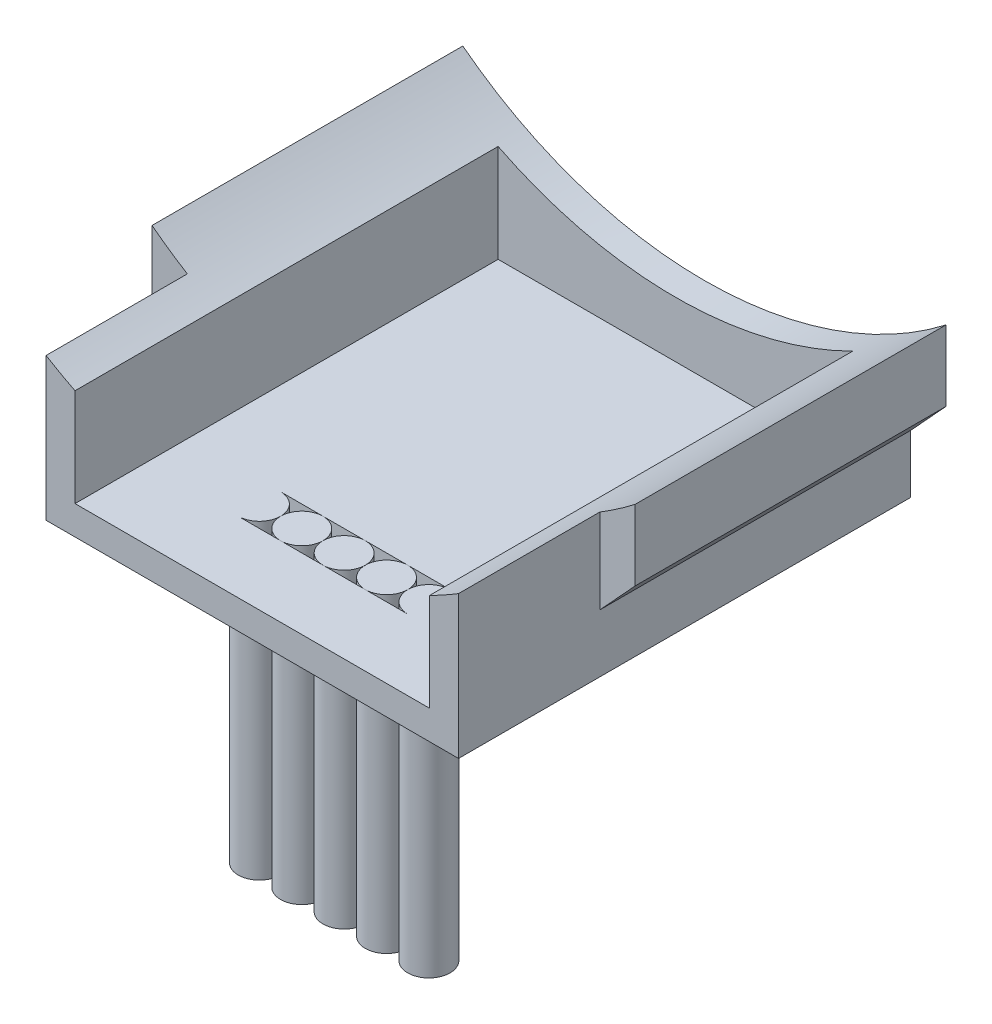
ISO-10303-21;
HEADER;
FILE_DESCRIPTION(('STEP AP214'),'2;1');
FILE_NAME('part.step','',(''),(''),'','','');
FILE_SCHEMA(('AUTOMOTIVE_DESIGN { 1 0 10303 214 1 1 1 1 }'));
ENDSEC;
DATA;
#1=APPLICATION_CONTEXT('core data for automotive mechanical design processes');
#2=APPLICATION_PROTOCOL_DEFINITION('international standard','automotive_design',2000,#1);
#3=PRODUCT_CONTEXT('',#1,'mechanical');
#4=PRODUCT('Part','Part','',(#3));
#5=PRODUCT_RELATED_PRODUCT_CATEGORY('part','',(#4));
#6=PRODUCT_DEFINITION_FORMATION('','',#4);
#7=PRODUCT_DEFINITION_CONTEXT('part definition',#1,'design');
#8=PRODUCT_DEFINITION('design','',#6,#7);
#9=PRODUCT_DEFINITION_SHAPE('','',#8);
#10=(LENGTH_UNIT() NAMED_UNIT(*) SI_UNIT(.MILLI.,.METRE.));
#11=(NAMED_UNIT(*) PLANE_ANGLE_UNIT() SI_UNIT($,.RADIAN.));
#12=(NAMED_UNIT(*) SI_UNIT($,.STERADIAN.) SOLID_ANGLE_UNIT());
#13=UNCERTAINTY_MEASURE_WITH_UNIT(LENGTH_MEASURE(1.E-05),#10,'distance_accuracy_value','');
#14=(GEOMETRIC_REPRESENTATION_CONTEXT(3) GLOBAL_UNCERTAINTY_ASSIGNED_CONTEXT((#13)) GLOBAL_UNIT_ASSIGNED_CONTEXT((#10,
#11,#12)) REPRESENTATION_CONTEXT('',''));
#15=CARTESIAN_POINT('',(0.,0.,0.));
#16=DIRECTION('',(0.,0.,1.));
#17=DIRECTION('',(1.,0.,0.));
#18=AXIS2_PLACEMENT_3D('',#15,#16,#17);
#19=CARTESIAN_POINT('',(-1.5,-26.975,-3.25));
#20=DIRECTION('',(0.,1.,0.));
#21=DIRECTION('',(0.,0.,1.));
#22=AXIS2_PLACEMENT_3D('',#19,#20,#21);
#23=CYLINDRICAL_SURFACE('',#22,0.749999999999999);
#24=CARTESIAN_POINT('',(-1.5,-26.975,-3.25));
#25=DIRECTION('',(0.,1.,0.));
#26=DIRECTION('',(0.,0.,1.));
#27=AXIS2_PLACEMENT_3D('',#24,#25,#26);
#28=CIRCLE('',#27,0.749999999999999);
#29=CARTESIAN_POINT('',(-1.5,-26.975,-2.5));
#30=VERTEX_POINT('',#29);
#31=EDGE_CURVE('E11',#30,#30,#28,.T.);
#32=ORIENTED_EDGE('',*,*,#31,.T.);
#33=EDGE_LOOP('',(#32));
#34=FACE_BOUND('',#33,.T.);
#35=CARTESIAN_POINT('',(-1.5,-15.975,-3.25));
#36=DIRECTION('',(0.,1.,0.));
#37=DIRECTION('',(0.,0.,1.));
#38=AXIS2_PLACEMENT_3D('',#35,#36,#37);
#39=CIRCLE('',#38,0.749999999999999);
#40=CARTESIAN_POINT('',(-1.5,-15.975,-2.5));
#41=VERTEX_POINT('',#40);
#42=EDGE_CURVE('E46',#41,#41,#39,.T.);
#43=ORIENTED_EDGE('',*,*,#42,.F.);
#44=EDGE_LOOP('',(#43));
#45=FACE_BOUND('',#44,.T.);
#46=ADVANCED_FACE('F43',(#34,#45),#23,.T.);
#47=CARTESIAN_POINT('',(0.,-26.975,0.));
#48=DIRECTION('',(0.,1.,0.));
#49=DIRECTION('',(0.,0.,1.));
#50=AXIS2_PLACEMENT_3D('',#47,#48,#49);
#51=PLANE('',#50);
#52=ORIENTED_EDGE('',*,*,#31,.F.);
#53=EDGE_LOOP('',(#52));
#54=FACE_BOUND('',#53,.T.);
#55=ADVANCED_FACE('F58',(#54),#51,.F.);
#56=CARTESIAN_POINT('',(0.,-15.975,0.));
#57=DIRECTION('',(0.,1.,0.));
#58=DIRECTION('',(0.,0.,1.));
#59=AXIS2_PLACEMENT_3D('',#56,#57,#58);
#60=PLANE('',#59);
#61=ORIENTED_EDGE('',*,*,#42,.T.);
#62=EDGE_LOOP('',(#61));
#63=FACE_BOUND('',#62,.T.);
#64=ADVANCED_FACE('F55',(#63),#60,.T.);
#65=CLOSED_SHELL('',(#46,#55,#64));
#66=MANIFOLD_SOLID_BREP('B2',#65);
#67=CARTESIAN_POINT('',(0.,-26.975,-3.25));
#68=DIRECTION('',(0.,1.,0.));
#69=DIRECTION('',(0.,0.,1.));
#70=AXIS2_PLACEMENT_3D('',#67,#68,#69);
#71=CYLINDRICAL_SURFACE('',#70,0.749999999999999);
#72=CARTESIAN_POINT('',(0.,-26.975,-3.25));
#73=DIRECTION('',(0.,1.,0.));
#74=DIRECTION('',(0.,0.,1.));
#75=AXIS2_PLACEMENT_3D('',#72,#73,#74);
#76=CIRCLE('',#75,0.749999999999999);
#77=CARTESIAN_POINT('',(0.,-26.975,-2.5));
#78=VERTEX_POINT('',#77);
#79=EDGE_CURVE('E42',#78,#78,#76,.T.);
#80=ORIENTED_EDGE('',*,*,#79,.T.);
#81=EDGE_LOOP('',(#80));
#82=FACE_BOUND('',#81,.T.);
#83=CARTESIAN_POINT('',(0.,-15.975,-3.25));
#84=DIRECTION('',(0.,1.,0.));
#85=DIRECTION('',(0.,0.,1.));
#86=AXIS2_PLACEMENT_3D('',#83,#84,#85);
#87=CIRCLE('',#86,0.749999999999999);
#88=CARTESIAN_POINT('',(0.,-15.975,-2.5));
#89=VERTEX_POINT('',#88);
#90=EDGE_CURVE('E102',#89,#89,#87,.T.);
#91=ORIENTED_EDGE('',*,*,#90,.F.);
#92=EDGE_LOOP('',(#91));
#93=FACE_BOUND('',#92,.T.);
#94=ADVANCED_FACE('F99',(#82,#93),#71,.T.);
#95=CARTESIAN_POINT('',(0.,-26.975,0.));
#96=DIRECTION('',(0.,1.,0.));
#97=DIRECTION('',(0.,0.,1.));
#98=AXIS2_PLACEMENT_3D('',#95,#96,#97);
#99=PLANE('',#98);
#100=ORIENTED_EDGE('',*,*,#79,.F.);
#101=EDGE_LOOP('',(#100));
#102=FACE_BOUND('',#101,.T.);
#103=ADVANCED_FACE('F114',(#102),#99,.F.);
#104=CARTESIAN_POINT('',(0.,-15.975,0.));
#105=DIRECTION('',(0.,1.,0.));
#106=DIRECTION('',(0.,0.,1.));
#107=AXIS2_PLACEMENT_3D('',#104,#105,#106);
#108=PLANE('',#107);
#109=ORIENTED_EDGE('',*,*,#90,.T.);
#110=EDGE_LOOP('',(#109));
#111=FACE_BOUND('',#110,.T.);
#112=ADVANCED_FACE('F111',(#111),#108,.T.);
#113=CLOSED_SHELL('',(#94,#103,#112));
#114=MANIFOLD_SOLID_BREP('B6',#113);
#115=CARTESIAN_POINT('',(1.5,-26.975,-3.25));
#116=DIRECTION('',(0.,1.,0.));
#117=DIRECTION('',(0.,0.,1.));
#118=AXIS2_PLACEMENT_3D('',#115,#116,#117);
#119=CYLINDRICAL_SURFACE('',#118,0.749999999999998);
#120=CARTESIAN_POINT('',(1.5,-26.975,-3.25));
#121=DIRECTION('',(0.,1.,0.));
#122=DIRECTION('',(0.,0.,1.));
#123=AXIS2_PLACEMENT_3D('',#120,#121,#122);
#124=CIRCLE('',#123,0.749999999999998);
#125=CARTESIAN_POINT('',(1.5,-26.975,-2.5));
#126=VERTEX_POINT('',#125);
#127=EDGE_CURVE('E98',#126,#126,#124,.T.);
#128=ORIENTED_EDGE('',*,*,#127,.T.);
#129=EDGE_LOOP('',(#128));
#130=FACE_BOUND('',#129,.T.);
#131=CARTESIAN_POINT('',(1.5,-15.975,-3.25));
#132=DIRECTION('',(0.,1.,0.));
#133=DIRECTION('',(0.,0.,1.));
#134=AXIS2_PLACEMENT_3D('',#131,#132,#133);
#135=CIRCLE('',#134,0.749999999999998);
#136=CARTESIAN_POINT('',(1.5,-15.975,-2.5));
#137=VERTEX_POINT('',#136);
#138=EDGE_CURVE('E159',#137,#137,#135,.T.);
#139=ORIENTED_EDGE('',*,*,#138,.F.);
#140=EDGE_LOOP('',(#139));
#141=FACE_BOUND('',#140,.T.);
#142=ADVANCED_FACE('F156',(#130,#141),#119,.T.);
#143=CARTESIAN_POINT('',(0.,-26.975,0.));
#144=DIRECTION('',(0.,1.,0.));
#145=DIRECTION('',(0.,0.,1.));
#146=AXIS2_PLACEMENT_3D('',#143,#144,#145);
#147=PLANE('',#146);
#148=ORIENTED_EDGE('',*,*,#127,.F.);
#149=EDGE_LOOP('',(#148));
#150=FACE_BOUND('',#149,.T.);
#151=ADVANCED_FACE('F171',(#150),#147,.F.);
#152=CARTESIAN_POINT('',(0.,-15.975,0.));
#153=DIRECTION('',(0.,1.,0.));
#154=DIRECTION('',(0.,0.,1.));
#155=AXIS2_PLACEMENT_3D('',#152,#153,#154);
#156=PLANE('',#155);
#157=ORIENTED_EDGE('',*,*,#138,.T.);
#158=EDGE_LOOP('',(#157));
#159=FACE_BOUND('',#158,.T.);
#160=ADVANCED_FACE('F168',(#159),#156,.T.);
#161=CLOSED_SHELL('',(#142,#151,#160));
#162=MANIFOLD_SOLID_BREP('B37',#161);
#163=CARTESIAN_POINT('',(-7.3,-17.,-16.));
#164=DIRECTION('',(-1.,0.,0.));
#165=DIRECTION('',(0.,0.,1.));
#166=AXIS2_PLACEMENT_3D('',#163,#164,#165);
#167=PLANE('',#166);
#168=DIRECTION('',(0.,0.,1.));
#169=VECTOR('',#168,1.);
#170=CARTESIAN_POINT('',(-7.3,-11.9461290801665,-16.));
#171=LINE('',#170,#169);
#172=CARTESIAN_POINT('',(-7.3,-11.9461290801665,-5.));
#173=VERTEX_POINT('',#172);
#174=CARTESIAN_POINT('',(-7.3,-11.9461290801665,0.));
#175=VERTEX_POINT('',#174);
#176=EDGE_CURVE('E455',#173,#175,#171,.T.);
#177=ORIENTED_EDGE('',*,*,#176,.F.);
#178=DIRECTION('',(0.,-1.,0.));
#179=VECTOR('',#178,1.);
#180=CARTESIAN_POINT('',(-7.3,-11.9461290801665,-5.));
#181=LINE('',#180,#179);
#182=CARTESIAN_POINT('',(-7.3,-14.9461290801665,-5.));
#183=VERTEX_POINT('',#182);
#184=EDGE_CURVE('E364',#173,#183,#181,.T.);
#185=ORIENTED_EDGE('',*,*,#184,.T.);
#186=DIRECTION('',(0.,0.,-1.));
#187=VECTOR('',#186,1.);
#188=CARTESIAN_POINT('',(-7.3,-14.9461290801665,-5.));
#189=LINE('',#188,#187);
#190=CARTESIAN_POINT('',(-7.3,-14.9461290801665,-16.));
#191=VERTEX_POINT('',#190);
#192=EDGE_CURVE('E373',#183,#191,#189,.T.);
#193=ORIENTED_EDGE('',*,*,#192,.T.);
#194=DIRECTION('',(0.,-1.,0.));
#195=VECTOR('',#194,1.);
#196=CARTESIAN_POINT('',(-7.3,-17.,-16.));
#197=LINE('',#196,#195);
#198=CARTESIAN_POINT('',(-7.3,-17.,-16.));
#199=VERTEX_POINT('',#198);
#200=EDGE_CURVE('E416',#191,#199,#197,.T.);
#201=ORIENTED_EDGE('',*,*,#200,.T.);
#202=DIRECTION('',(0.,0.,1.));
#203=VECTOR('',#202,1.);
#204=CARTESIAN_POINT('',(-7.3,-17.,-16.));
#205=LINE('',#204,#203);
#206=CARTESIAN_POINT('',(-7.3,-17.,0.));
#207=VERTEX_POINT('',#206);
#208=EDGE_CURVE('E453',#199,#207,#205,.T.);
#209=ORIENTED_EDGE('',*,*,#208,.T.);
#210=DIRECTION('',(0.,-1.,0.));
#211=VECTOR('',#210,1.);
#212=CARTESIAN_POINT('',(-7.3,-17.,0.));
#213=LINE('',#212,#211);
#214=EDGE_CURVE('E440',#175,#207,#213,.T.);
#215=ORIENTED_EDGE('',*,*,#214,.F.);
#216=EDGE_LOOP('',(#177,#185,#193,#201,#209,#215));
#217=FACE_BOUND('',#216,.T.);
#218=ADVANCED_FACE('F204',(#217),#167,.T.);
#219=CARTESIAN_POINT('',(7.3,-17.,-16.));
#220=DIRECTION('',(1.,0.,0.));
#221=DIRECTION('',(0.,0.,-1.));
#222=AXIS2_PLACEMENT_3D('',#219,#220,#221);
#223=PLANE('',#222);
#224=DIRECTION('',(0.,0.,-1.));
#225=VECTOR('',#224,1.);
#226=CARTESIAN_POINT('',(7.3,-14.9461290801665,-5.));
#227=LINE('',#226,#225);
#228=CARTESIAN_POINT('',(7.3,-14.9461290801665,-5.));
#229=VERTEX_POINT('',#228);
#230=CARTESIAN_POINT('',(7.3,-14.9461290801665,-16.));
#231=VERTEX_POINT('',#230);
#232=EDGE_CURVE('E398',#229,#231,#227,.T.);
#233=ORIENTED_EDGE('',*,*,#232,.F.);
#234=DIRECTION('',(0.,1.,0.));
#235=VECTOR('',#234,1.);
#236=CARTESIAN_POINT('',(7.3,-11.9461290801665,-5.));
#237=LINE('',#236,#235);
#238=CARTESIAN_POINT('',(7.3,-11.9461290801665,-5.));
#239=VERTEX_POINT('',#238);
#240=EDGE_CURVE('E390',#229,#239,#237,.T.);
#241=ORIENTED_EDGE('',*,*,#240,.T.);
#242=DIRECTION('',(0.,0.,1.));
#243=VECTOR('',#242,1.);
#244=CARTESIAN_POINT('',(7.3,-11.9461290801665,-16.));
#245=LINE('',#244,#243);
#246=CARTESIAN_POINT('',(7.3,-11.9461290801665,0.));
#247=VERTEX_POINT('',#246);
#248=EDGE_CURVE('E448',#239,#247,#245,.T.);
#249=ORIENTED_EDGE('',*,*,#248,.T.);
#250=DIRECTION('',(0.,1.,0.));
#251=VECTOR('',#250,1.);
#252=CARTESIAN_POINT('',(7.3,-17.,0.));
#253=LINE('',#252,#251);
#254=CARTESIAN_POINT('',(7.3,-17.,0.));
#255=VERTEX_POINT('',#254);
#256=EDGE_CURVE('E417',#255,#247,#253,.T.);
#257=ORIENTED_EDGE('',*,*,#256,.F.);
#258=DIRECTION('',(0.,0.,1.));
#259=VECTOR('',#258,1.);
#260=CARTESIAN_POINT('',(7.3,-17.,-16.));
#261=LINE('',#260,#259);
#262=CARTESIAN_POINT('',(7.3,-17.,-16.));
#263=VERTEX_POINT('',#262);
#264=EDGE_CURVE('E451',#263,#255,#261,.T.);
#265=ORIENTED_EDGE('',*,*,#264,.F.);
#266=DIRECTION('',(0.,1.,0.));
#267=VECTOR('',#266,1.);
#268=CARTESIAN_POINT('',(7.3,-17.,-16.));
#269=LINE('',#268,#267);
#270=EDGE_CURVE('E422',#263,#231,#269,.T.);
#271=ORIENTED_EDGE('',*,*,#270,.T.);
#272=EDGE_LOOP('',(#233,#241,#249,#257,#265,#271));
#273=FACE_BOUND('',#272,.T.);
#274=ADVANCED_FACE('F499',(#273),#223,.T.);
#275=CARTESIAN_POINT('',(-7.3,-17.,-16.));
#276=DIRECTION('',(0.,-1.,0.));
#277=DIRECTION('',(1.,0.,0.));
#278=AXIS2_PLACEMENT_3D('',#275,#276,#277);
#279=PLANE('',#278);
#280=CARTESIAN_POINT('',(-3.,-17.,-3.25));
#281=DIRECTION('',(0.,-1.,0.));
#282=DIRECTION('',(1.,0.,0.));
#283=AXIS2_PLACEMENT_3D('',#280,#281,#282);
#284=CIRCLE('',#283,0.75);
#285=CARTESIAN_POINT('',(-3.,-17.,-2.5));
#286=VERTEX_POINT('',#285);
#287=CARTESIAN_POINT('',(-3.,-17.,-4.));
#288=VERTEX_POINT('',#287);
#289=EDGE_CURVE('E219',#286,#288,#284,.T.);
#290=ORIENTED_EDGE('',*,*,#289,.F.);
#291=DIRECTION('',(-1.,0.,0.));
#292=VECTOR('',#291,1.);
#293=CARTESIAN_POINT('',(-3.,-17.,-2.5));
#294=LINE('',#293,#292);
#295=CARTESIAN_POINT('',(3.,-17.,-2.5));
#296=VERTEX_POINT('',#295);
#297=EDGE_CURVE('E344',#296,#286,#294,.T.);
#298=ORIENTED_EDGE('',*,*,#297,.F.);
#299=CARTESIAN_POINT('',(3.,-17.,-3.25));
#300=DIRECTION('',(0.,-1.,0.));
#301=DIRECTION('',(-1.,0.,0.));
#302=AXIS2_PLACEMENT_3D('',#299,#300,#301);
#303=CIRCLE('',#302,0.75);
#304=CARTESIAN_POINT('',(3.,-17.,-4.));
#305=VERTEX_POINT('',#304);
#306=EDGE_CURVE('E338',#305,#296,#303,.T.);
#307=ORIENTED_EDGE('',*,*,#306,.F.);
#308=DIRECTION('',(1.,0.,0.));
#309=VECTOR('',#308,1.);
#310=CARTESIAN_POINT('',(-3.,-17.,-4.));
#311=LINE('',#310,#309);
#312=EDGE_CURVE('E331',#288,#305,#311,.T.);
#313=ORIENTED_EDGE('',*,*,#312,.F.);
#314=EDGE_LOOP('',(#290,#298,#307,#313));
#315=FACE_BOUND('',#314,.T.);
#316=DIRECTION('',(1.,0.,0.));
#317=VECTOR('',#316,1.);
#318=CARTESIAN_POINT('',(-7.3,-17.,0.));
#319=LINE('',#318,#317);
#320=EDGE_CURVE('E443',#207,#255,#319,.T.);
#321=ORIENTED_EDGE('',*,*,#320,.F.);
#322=ORIENTED_EDGE('',*,*,#208,.F.);
#323=DIRECTION('',(1.,0.,0.));
#324=VECTOR('',#323,1.);
#325=CARTESIAN_POINT('',(-7.3,-17.,-16.));
#326=LINE('',#325,#324);
#327=EDGE_CURVE('E419',#199,#263,#326,.T.);
#328=ORIENTED_EDGE('',*,*,#327,.T.);
#329=ORIENTED_EDGE('',*,*,#264,.T.);
#330=EDGE_LOOP('',(#321,#322,#328,#329));
#331=FACE_BOUND('',#330,.T.);
#332=ADVANCED_FACE('F342',(#315,#331),#279,.T.);
#333=CARTESIAN_POINT('',(0.,0.,-16.));
#334=DIRECTION('',(0.,0.,1.));
#335=DIRECTION('',(1.,0.,0.));
#336=AXIS2_PLACEMENT_3D('',#333,#334,#335);
#337=CYLINDRICAL_SURFACE('',#336,14.);
#338=DIRECTION('',(0.,0.,1.));
#339=VECTOR('',#338,1.);
#340=CARTESIAN_POINT('',(-6.275,-12.514966040705,-16.));
#341=LINE('',#340,#339);
#342=CARTESIAN_POINT('',(-6.275,-12.514966040705,-14.975));
#343=VERTEX_POINT('',#342);
#344=CARTESIAN_POINT('',(-6.275,-12.514966040705,0.));
#345=VERTEX_POINT('',#344);
#346=EDGE_CURVE('E457',#343,#345,#341,.T.);
#347=ORIENTED_EDGE('',*,*,#346,.F.);
#348=CARTESIAN_POINT('',(0.,0.,-14.975));
#349=DIRECTION('',(0.,0.,1.));
#350=DIRECTION('',(1.,0.,0.));
#351=AXIS2_PLACEMENT_3D('',#348,#349,#350);
#352=CIRCLE('',#351,14.);
#353=CARTESIAN_POINT('',(6.275,-12.514966040705,-14.975));
#354=VERTEX_POINT('',#353);
#355=EDGE_CURVE('E400',#354,#343,#352,.F.);
#356=ORIENTED_EDGE('',*,*,#355,.F.);
#357=DIRECTION('',(0.,0.,1.));
#358=VECTOR('',#357,1.);
#359=CARTESIAN_POINT('',(6.275,-12.514966040705,-16.));
#360=LINE('',#359,#358);
#361=CARTESIAN_POINT('',(6.275,-12.514966040705,0.));
#362=VERTEX_POINT('',#361);
#363=EDGE_CURVE('E425',#354,#362,#360,.T.);
#364=ORIENTED_EDGE('',*,*,#363,.T.);
#365=CARTESIAN_POINT('',(0.,0.,0.));
#366=DIRECTION('',(0.,0.,-1.));
#367=DIRECTION('',(1.,0.,0.));
#368=AXIS2_PLACEMENT_3D('',#365,#366,#367);
#369=CIRCLE('',#368,14.);
#370=EDGE_CURVE('E413',#247,#362,#369,.T.);
#371=ORIENTED_EDGE('',*,*,#370,.F.);
#372=ORIENTED_EDGE('',*,*,#248,.F.);
#373=CARTESIAN_POINT('',(0.,0.,-5.));
#374=DIRECTION('',(0.,0.,1.));
#375=DIRECTION('',(-1.,0.,0.));
#376=AXIS2_PLACEMENT_3D('',#373,#374,#375);
#377=CIRCLE('',#376,14.);
#378=CARTESIAN_POINT('',(8.55,-11.0859144864102,-5.));
#379=VERTEX_POINT('',#378);
#380=EDGE_CURVE('E381',#239,#379,#377,.T.);
#381=ORIENTED_EDGE('',*,*,#380,.T.);
#382=DIRECTION('',(0.,0.,-1.));
#383=VECTOR('',#382,1.);
#384=CARTESIAN_POINT('',(8.55,-11.0859144864102,-5.));
#385=LINE('',#384,#383);
#386=CARTESIAN_POINT('',(8.55,-11.0859144864102,-16.));
#387=VERTEX_POINT('',#386);
#388=EDGE_CURVE('E393',#379,#387,#385,.T.);
#389=ORIENTED_EDGE('',*,*,#388,.T.);
#390=CARTESIAN_POINT('',(0.,0.,-16.));
#391=DIRECTION('',(0.,0.,-1.));
#392=DIRECTION('',(1.,0.,0.));
#393=AXIS2_PLACEMENT_3D('',#390,#391,#392);
#394=CIRCLE('',#393,14.);
#395=CARTESIAN_POINT('',(-8.55,-11.0859144864102,-16.));
#396=VERTEX_POINT('',#395);
#397=EDGE_CURVE('E414',#387,#396,#394,.T.);
#398=ORIENTED_EDGE('',*,*,#397,.T.);
#399=DIRECTION('',(0.,0.,-1.));
#400=VECTOR('',#399,1.);
#401=CARTESIAN_POINT('',(-8.55,-11.0859144864102,-5.));
#402=LINE('',#401,#400);
#403=CARTESIAN_POINT('',(-8.55,-11.0859144864102,-5.));
#404=VERTEX_POINT('',#403);
#405=EDGE_CURVE('E377',#404,#396,#402,.T.);
#406=ORIENTED_EDGE('',*,*,#405,.F.);
#407=CARTESIAN_POINT('',(0.,0.,-5.));
#408=DIRECTION('',(0.,0.,1.));
#409=DIRECTION('',(-1.,0.,0.));
#410=AXIS2_PLACEMENT_3D('',#407,#408,#409);
#411=CIRCLE('',#410,14.);
#412=EDGE_CURVE('E362',#404,#173,#411,.T.);
#413=ORIENTED_EDGE('',*,*,#412,.T.);
#414=ORIENTED_EDGE('',*,*,#176,.T.);
#415=CARTESIAN_POINT('',(0.,0.,0.));
#416=DIRECTION('',(0.,0.,-1.));
#417=DIRECTION('',(1.,0.,0.));
#418=AXIS2_PLACEMENT_3D('',#415,#416,#417);
#419=CIRCLE('',#418,14.);
#420=EDGE_CURVE('E437',#345,#175,#419,.T.);
#421=ORIENTED_EDGE('',*,*,#420,.F.);
#422=EDGE_LOOP('',(#347,#356,#364,#371,#372,#381,#389,#398,#406,#413,#414,#421));
#423=FACE_BOUND('',#422,.T.);
#424=ADVANCED_FACE('F510',(#423),#337,.F.);
#425=CARTESIAN_POINT('',(-6.275,-15.975,-16.));
#426=DIRECTION('',(1.,0.,0.));
#427=DIRECTION('',(0.,1.,0.));
#428=AXIS2_PLACEMENT_3D('',#425,#426,#427);
#429=PLANE('',#428);
#430=DIRECTION('',(0.,-1.,0.));
#431=VECTOR('',#430,1.);
#432=CARTESIAN_POINT('',(-6.275,-15.975,-14.975));
#433=LINE('',#432,#431);
#434=CARTESIAN_POINT('',(-6.275,-15.975,-14.975));
#435=VERTEX_POINT('',#434);
#436=EDGE_CURVE('E410',#343,#435,#433,.T.);
#437=ORIENTED_EDGE('',*,*,#436,.F.);
#438=ORIENTED_EDGE('',*,*,#346,.T.);
#439=DIRECTION('',(0.,1.,0.));
#440=VECTOR('',#439,1.);
#441=CARTESIAN_POINT('',(-6.275,-15.975,0.));
#442=LINE('',#441,#440);
#443=CARTESIAN_POINT('',(-6.275,-15.975,0.));
#444=VERTEX_POINT('',#443);
#445=EDGE_CURVE('E434',#444,#345,#442,.T.);
#446=ORIENTED_EDGE('',*,*,#445,.F.);
#447=DIRECTION('',(0.,0.,1.));
#448=VECTOR('',#447,1.);
#449=CARTESIAN_POINT('',(-6.275,-15.975,-16.));
#450=LINE('',#449,#448);
#451=EDGE_CURVE('E459',#435,#444,#450,.T.);
#452=ORIENTED_EDGE('',*,*,#451,.F.);
#453=EDGE_LOOP('',(#437,#438,#446,#452));
#454=FACE_BOUND('',#453,.T.);
#455=ADVANCED_FACE('F513',(#454),#429,.T.);
#456=CARTESIAN_POINT('',(-6.275,-15.975,-16.));
#457=DIRECTION('',(0.,1.,0.));
#458=DIRECTION('',(0.,0.,1.));
#459=AXIS2_PLACEMENT_3D('',#456,#457,#458);
#460=PLANE('',#459);
#461=DIRECTION('',(1.,0.,0.));
#462=VECTOR('',#461,1.);
#463=CARTESIAN_POINT('',(-6.275,-15.975,-2.5));
#464=LINE('',#463,#462);
#465=CARTESIAN_POINT('',(-3.,-15.975,-2.5));
#466=VERTEX_POINT('',#465);
#467=CARTESIAN_POINT('',(3.,-15.975,-2.5));
#468=VERTEX_POINT('',#467);
#469=EDGE_CURVE('E154',#466,#468,#464,.T.);
#470=ORIENTED_EDGE('',*,*,#469,.F.);
#471=CARTESIAN_POINT('',(-3.,-15.975,-3.25));
#472=DIRECTION('',(0.,1.,0.));
#473=DIRECTION('',(0.,0.,1.));
#474=AXIS2_PLACEMENT_3D('',#471,#472,#473);
#475=CIRCLE('',#474,0.75);
#476=CARTESIAN_POINT('',(-3.,-15.975,-4.));
#477=VERTEX_POINT('',#476);
#478=EDGE_CURVE('E469',#477,#466,#475,.F.);
#479=ORIENTED_EDGE('',*,*,#478,.F.);
#480=DIRECTION('',(-1.,0.,0.));
#481=VECTOR('',#480,1.);
#482=CARTESIAN_POINT('',(-6.275,-15.975,-4.));
#483=LINE('',#482,#481);
#484=CARTESIAN_POINT('',(3.00000000000001,-15.975,-4.));
#485=VERTEX_POINT('',#484);
#486=EDGE_CURVE('E212',#485,#477,#483,.T.);
#487=ORIENTED_EDGE('',*,*,#486,.F.);
#488=CARTESIAN_POINT('',(3.,-15.975,-3.25));
#489=DIRECTION('',(0.,1.,0.));
#490=DIRECTION('',(0.,0.,1.));
#491=AXIS2_PLACEMENT_3D('',#488,#489,#490);
#492=CIRCLE('',#491,0.75);
#493=EDGE_CURVE('E227',#468,#485,#492,.F.);
#494=ORIENTED_EDGE('',*,*,#493,.F.);
#495=EDGE_LOOP('',(#470,#479,#487,#494));
#496=FACE_BOUND('',#495,.T.);
#497=DIRECTION('',(1.,0.,0.));
#498=VECTOR('',#497,1.);
#499=CARTESIAN_POINT('',(-6.275,-15.975,-14.975));
#500=LINE('',#499,#498);
#501=CARTESIAN_POINT('',(6.275,-15.975,-14.975));
#502=VERTEX_POINT('',#501);
#503=EDGE_CURVE('E407',#435,#502,#500,.T.);
#504=ORIENTED_EDGE('',*,*,#503,.F.);
#505=ORIENTED_EDGE('',*,*,#451,.T.);
#506=DIRECTION('',(-1.,0.,0.));
#507=VECTOR('',#506,1.);
#508=CARTESIAN_POINT('',(-6.275,-15.975,0.));
#509=LINE('',#508,#507);
#510=CARTESIAN_POINT('',(6.275,-15.975,0.));
#511=VERTEX_POINT('',#510);
#512=EDGE_CURVE('E431',#511,#444,#509,.T.);
#513=ORIENTED_EDGE('',*,*,#512,.F.);
#514=DIRECTION('',(0.,0.,1.));
#515=VECTOR('',#514,1.);
#516=CARTESIAN_POINT('',(6.275,-15.975,-16.));
#517=LINE('',#516,#515);
#518=EDGE_CURVE('E461',#502,#511,#517,.T.);
#519=ORIENTED_EDGE('',*,*,#518,.F.);
#520=EDGE_LOOP('',(#504,#505,#513,#519));
#521=FACE_BOUND('',#520,.T.);
#522=ADVANCED_FACE('F472',(#496,#521),#460,.T.);
#523=CARTESIAN_POINT('',(6.275,-15.975,-16.));
#524=DIRECTION('',(-1.,0.,0.));
#525=DIRECTION('',(0.,-1.,0.));
#526=AXIS2_PLACEMENT_3D('',#523,#524,#525);
#527=PLANE('',#526);
#528=DIRECTION('',(0.,1.,0.));
#529=VECTOR('',#528,1.);
#530=CARTESIAN_POINT('',(6.275,-15.975,-14.975));
#531=LINE('',#530,#529);
#532=EDGE_CURVE('E450',#502,#354,#531,.T.);
#533=ORIENTED_EDGE('',*,*,#532,.F.);
#534=ORIENTED_EDGE('',*,*,#518,.T.);
#535=DIRECTION('',(0.,-1.,0.));
#536=VECTOR('',#535,1.);
#537=CARTESIAN_POINT('',(6.275,-15.975,0.));
#538=LINE('',#537,#536);
#539=EDGE_CURVE('E428',#362,#511,#538,.T.);
#540=ORIENTED_EDGE('',*,*,#539,.F.);
#541=ORIENTED_EDGE('',*,*,#363,.F.);
#542=EDGE_LOOP('',(#533,#534,#540,#541));
#543=FACE_BOUND('',#542,.T.);
#544=ADVANCED_FACE('F206',(#543),#527,.T.);
#545=CARTESIAN_POINT('',(0.,0.,-16.));
#546=DIRECTION('',(0.,0.,1.));
#547=DIRECTION('',(1.,0.,0.));
#548=AXIS2_PLACEMENT_3D('',#545,#546,#547);
#549=PLANE('',#548);
#550=ORIENTED_EDGE('',*,*,#200,.F.);
#551=DIRECTION('',(-0.676646736169615,0.736307812284379,0.));
#552=VECTOR('',#551,1.);
#553=CARTESIAN_POINT('',(-7.3,-14.9461290801665,-16.));
#554=LINE('',#553,#552);
#555=CARTESIAN_POINT('',(-8.55,-13.5859144864102,-16.));
#556=VERTEX_POINT('',#555);
#557=EDGE_CURVE('E368',#191,#556,#554,.T.);
#558=ORIENTED_EDGE('',*,*,#557,.T.);
#559=DIRECTION('',(0.,1.,0.));
#560=VECTOR('',#559,1.);
#561=CARTESIAN_POINT('',(-8.55,-13.5859144864102,-16.));
#562=LINE('',#561,#560);
#563=EDGE_CURVE('E359',#556,#396,#562,.T.);
#564=ORIENTED_EDGE('',*,*,#563,.T.);
#565=ORIENTED_EDGE('',*,*,#397,.F.);
#566=DIRECTION('',(0.,-1.,0.));
#567=VECTOR('',#566,1.);
#568=CARTESIAN_POINT('',(8.55,-13.5859144864102,-16.));
#569=LINE('',#568,#567);
#570=CARTESIAN_POINT('',(8.55,-13.5859144864102,-16.));
#571=VERTEX_POINT('',#570);
#572=EDGE_CURVE('E376',#387,#571,#569,.T.);
#573=ORIENTED_EDGE('',*,*,#572,.T.);
#574=DIRECTION('',(-0.676646736169615,-0.736307812284379,0.));
#575=VECTOR('',#574,1.);
#576=CARTESIAN_POINT('',(7.3,-14.9461290801665,-16.));
#577=LINE('',#576,#575);
#578=EDGE_CURVE('E385',#571,#231,#577,.T.);
#579=ORIENTED_EDGE('',*,*,#578,.T.);
#580=ORIENTED_EDGE('',*,*,#270,.F.);
#581=ORIENTED_EDGE('',*,*,#327,.F.);
#582=EDGE_LOOP('',(#550,#558,#564,#565,#573,#579,#580,#581));
#583=FACE_BOUND('',#582,.T.);
#584=ADVANCED_FACE('F521',(#583),#549,.F.);
#585=CARTESIAN_POINT('',(0.,0.,0.));
#586=DIRECTION('',(0.,0.,1.));
#587=DIRECTION('',(1.,0.,0.));
#588=AXIS2_PLACEMENT_3D('',#585,#586,#587);
#589=PLANE('',#588);
#590=ORIENTED_EDGE('',*,*,#370,.T.);
#591=ORIENTED_EDGE('',*,*,#539,.T.);
#592=ORIENTED_EDGE('',*,*,#512,.T.);
#593=ORIENTED_EDGE('',*,*,#445,.T.);
#594=ORIENTED_EDGE('',*,*,#420,.T.);
#595=ORIENTED_EDGE('',*,*,#214,.T.);
#596=ORIENTED_EDGE('',*,*,#320,.T.);
#597=ORIENTED_EDGE('',*,*,#256,.T.);
#598=EDGE_LOOP('',(#590,#591,#592,#593,#594,#595,#596,#597));
#599=FACE_BOUND('',#598,.T.);
#600=ADVANCED_FACE('F526',(#599),#589,.T.);
#601=CARTESIAN_POINT('',(-7.3,-11.9451290801665,-14.975));
#602=DIRECTION('',(0.,0.,1.));
#603=DIRECTION('',(1.,0.,0.));
#604=AXIS2_PLACEMENT_3D('',#601,#602,#603);
#605=PLANE('',#604);
#606=ORIENTED_EDGE('',*,*,#355,.T.);
#607=ORIENTED_EDGE('',*,*,#436,.T.);
#608=ORIENTED_EDGE('',*,*,#503,.T.);
#609=ORIENTED_EDGE('',*,*,#532,.T.);
#610=EDGE_LOOP('',(#606,#607,#608,#609));
#611=FACE_BOUND('',#610,.T.);
#612=ADVANCED_FACE('F535',(#611),#605,.T.);
#613=CARTESIAN_POINT('',(7.3,-14.9461290801665,-5.));
#614=DIRECTION('',(0.736307812284379,-0.676646736169615,0.));
#615=DIRECTION('',(0.676646736169615,0.736307812284379,0.));
#616=AXIS2_PLACEMENT_3D('',#613,#614,#615);
#617=PLANE('',#616);
#618=ORIENTED_EDGE('',*,*,#578,.F.);
#619=DIRECTION('',(0.,0.,-1.));
#620=VECTOR('',#619,1.);
#621=CARTESIAN_POINT('',(8.55,-13.5859144864102,-5.));
#622=LINE('',#621,#620);
#623=CARTESIAN_POINT('',(8.55,-13.5859144864102,-5.));
#624=VERTEX_POINT('',#623);
#625=EDGE_CURVE('E401',#624,#571,#622,.T.);
#626=ORIENTED_EDGE('',*,*,#625,.F.);
#627=DIRECTION('',(-0.676646736169615,-0.736307812284379,0.));
#628=VECTOR('',#627,1.);
#629=CARTESIAN_POINT('',(7.3,-14.9461290801665,-5.));
#630=LINE('',#629,#628);
#631=EDGE_CURVE('E388',#624,#229,#630,.T.);
#632=ORIENTED_EDGE('',*,*,#631,.T.);
#633=ORIENTED_EDGE('',*,*,#232,.T.);
#634=EDGE_LOOP('',(#618,#626,#632,#633));
#635=FACE_BOUND('',#634,.T.);
#636=ADVANCED_FACE('F568',(#635),#617,.T.);
#637=CARTESIAN_POINT('',(8.55,-13.5859144864102,-5.));
#638=DIRECTION('',(1.,0.,0.));
#639=DIRECTION('',(0.,0.,-1.));
#640=AXIS2_PLACEMENT_3D('',#637,#638,#639);
#641=PLANE('',#640);
#642=ORIENTED_EDGE('',*,*,#572,.F.);
#643=ORIENTED_EDGE('',*,*,#388,.F.);
#644=DIRECTION('',(0.,-1.,0.));
#645=VECTOR('',#644,1.);
#646=CARTESIAN_POINT('',(8.55,-13.5859144864102,-5.));
#647=LINE('',#646,#645);
#648=EDGE_CURVE('E384',#379,#624,#647,.T.);
#649=ORIENTED_EDGE('',*,*,#648,.T.);
#650=ORIENTED_EDGE('',*,*,#625,.T.);
#651=EDGE_LOOP('',(#642,#643,#649,#650));
#652=FACE_BOUND('',#651,.T.);
#653=ADVANCED_FACE('F552',(#652),#641,.T.);
#654=CARTESIAN_POINT('',(0.,0.,-5.));
#655=DIRECTION('',(0.,0.,-1.));
#656=DIRECTION('',(-1.,0.,0.));
#657=AXIS2_PLACEMENT_3D('',#654,#655,#656);
#658=PLANE('',#657);
#659=ORIENTED_EDGE('',*,*,#380,.F.);
#660=ORIENTED_EDGE('',*,*,#240,.F.);
#661=ORIENTED_EDGE('',*,*,#631,.F.);
#662=ORIENTED_EDGE('',*,*,#648,.F.);
#663=EDGE_LOOP('',(#659,#660,#661,#662));
#664=FACE_BOUND('',#663,.T.);
#665=ADVANCED_FACE('F548',(#664),#658,.F.);
#666=CARTESIAN_POINT('',(-7.3,-14.9461290801665,-5.));
#667=DIRECTION('',(-0.736307812284379,-0.676646736169615,0.));
#668=DIRECTION('',(0.676646736169615,-0.736307812284379,0.));
#669=AXIS2_PLACEMENT_3D('',#666,#667,#668);
#670=PLANE('',#669);
#671=ORIENTED_EDGE('',*,*,#557,.F.);
#672=ORIENTED_EDGE('',*,*,#192,.F.);
#673=DIRECTION('',(-0.676646736169615,0.736307812284379,0.));
#674=VECTOR('',#673,1.);
#675=CARTESIAN_POINT('',(-7.3,-14.9461290801665,-5.));
#676=LINE('',#675,#674);
#677=CARTESIAN_POINT('',(-8.55,-13.5859144864102,-5.));
#678=VERTEX_POINT('',#677);
#679=EDGE_CURVE('E355',#183,#678,#676,.T.);
#680=ORIENTED_EDGE('',*,*,#679,.T.);
#681=DIRECTION('',(0.,0.,-1.));
#682=VECTOR('',#681,1.);
#683=CARTESIAN_POINT('',(-8.55,-13.5859144864102,-5.));
#684=LINE('',#683,#682);
#685=EDGE_CURVE('E367',#678,#556,#684,.T.);
#686=ORIENTED_EDGE('',*,*,#685,.T.);
#687=EDGE_LOOP('',(#671,#672,#680,#686));
#688=FACE_BOUND('',#687,.T.);
#689=ADVANCED_FACE('F561',(#688),#670,.T.);
#690=CARTESIAN_POINT('',(-8.55,-13.5859144864102,-5.));
#691=DIRECTION('',(-1.,0.,0.));
#692=DIRECTION('',(0.,0.,1.));
#693=AXIS2_PLACEMENT_3D('',#690,#691,#692);
#694=PLANE('',#693);
#695=ORIENTED_EDGE('',*,*,#563,.F.);
#696=ORIENTED_EDGE('',*,*,#685,.F.);
#697=DIRECTION('',(0.,1.,0.));
#698=VECTOR('',#697,1.);
#699=CARTESIAN_POINT('',(-8.55,-13.5859144864102,-5.));
#700=LINE('',#699,#698);
#701=EDGE_CURVE('E358',#678,#404,#700,.T.);
#702=ORIENTED_EDGE('',*,*,#701,.T.);
#703=ORIENTED_EDGE('',*,*,#405,.T.);
#704=EDGE_LOOP('',(#695,#696,#702,#703));
#705=FACE_BOUND('',#704,.T.);
#706=ADVANCED_FACE('F494',(#705),#694,.T.);
#707=CARTESIAN_POINT('',(0.,0.,-5.));
#708=DIRECTION('',(0.,0.,-1.));
#709=DIRECTION('',(-1.,0.,0.));
#710=AXIS2_PLACEMENT_3D('',#707,#708,#709);
#711=PLANE('',#710);
#712=ORIENTED_EDGE('',*,*,#679,.F.);
#713=ORIENTED_EDGE('',*,*,#184,.F.);
#714=ORIENTED_EDGE('',*,*,#412,.F.);
#715=ORIENTED_EDGE('',*,*,#701,.F.);
#716=EDGE_LOOP('',(#712,#713,#714,#715));
#717=FACE_BOUND('',#716,.T.);
#718=ADVANCED_FACE('F487',(#717),#711,.F.);
#719=CARTESIAN_POINT('',(-3.,-6.,-2.5));
#720=DIRECTION('',(0.,0.,1.));
#721=DIRECTION('',(1.,0.,0.));
#722=AXIS2_PLACEMENT_3D('',#719,#720,#721);
#723=PLANE('',#722);
#724=ORIENTED_EDGE('',*,*,#297,.T.);
#725=DIRECTION('',(0.,-1.,0.));
#726=VECTOR('',#725,1.);
#727=CARTESIAN_POINT('',(-3.,-6.,-2.5));
#728=LINE('',#727,#726);
#729=EDGE_CURVE('E350',#466,#286,#728,.T.);
#730=ORIENTED_EDGE('',*,*,#729,.F.);
#731=ORIENTED_EDGE('',*,*,#469,.T.);
#732=DIRECTION('',(0.,-1.,0.));
#733=VECTOR('',#732,1.);
#734=CARTESIAN_POINT('',(3.,-6.,-2.5));
#735=LINE('',#734,#733);
#736=EDGE_CURVE('E348',#468,#296,#735,.T.);
#737=ORIENTED_EDGE('',*,*,#736,.T.);
#738=EDGE_LOOP('',(#724,#730,#731,#737));
#739=FACE_BOUND('',#738,.T.);
#740=ADVANCED_FACE('F485',(#739),#723,.F.);
#741=CARTESIAN_POINT('',(-3.,-6.,-4.));
#742=DIRECTION('',(0.,0.,-1.));
#743=DIRECTION('',(-1.,0.,0.));
#744=AXIS2_PLACEMENT_3D('',#741,#742,#743);
#745=PLANE('',#744);
#746=ORIENTED_EDGE('',*,*,#312,.T.);
#747=DIRECTION('',(0.,-1.,0.));
#748=VECTOR('',#747,1.);
#749=CARTESIAN_POINT('',(3.,-6.,-4.));
#750=LINE('',#749,#748);
#751=EDGE_CURVE('E334',#485,#305,#750,.T.);
#752=ORIENTED_EDGE('',*,*,#751,.F.);
#753=ORIENTED_EDGE('',*,*,#486,.T.);
#754=DIRECTION('',(0.,-1.,0.));
#755=VECTOR('',#754,1.);
#756=CARTESIAN_POINT('',(-3.,-6.,-4.));
#757=LINE('',#756,#755);
#758=EDGE_CURVE('E336',#477,#288,#757,.T.);
#759=ORIENTED_EDGE('',*,*,#758,.T.);
#760=EDGE_LOOP('',(#746,#752,#753,#759));
#761=FACE_BOUND('',#760,.T.);
#762=ADVANCED_FACE('F333',(#761),#745,.F.);
#763=CARTESIAN_POINT('',(-3.,-26.975,-3.25));
#764=DIRECTION('',(0.,1.,0.));
#765=DIRECTION('',(0.,0.,1.));
#766=AXIS2_PLACEMENT_3D('',#763,#764,#765);
#767=CYLINDRICAL_SURFACE('',#766,0.75);
#768=ORIENTED_EDGE('',*,*,#478,.T.);
#769=ORIENTED_EDGE('',*,*,#729,.T.);
#770=ORIENTED_EDGE('',*,*,#289,.T.);
#771=ORIENTED_EDGE('',*,*,#758,.F.);
#772=EDGE_LOOP('',(#768,#769,#770,#771));
#773=FACE_BOUND('',#772,.T.);
#774=CARTESIAN_POINT('',(-3.,-26.975,-3.25));
#775=DIRECTION('',(0.,1.,0.));
#776=DIRECTION('',(0.,0.,1.));
#777=AXIS2_PLACEMENT_3D('',#774,#775,#776);
#778=CIRCLE('',#777,0.75);
#779=CARTESIAN_POINT('',(-3.,-26.975,-2.5));
#780=VERTEX_POINT('',#779);
#781=EDGE_CURVE('E474',#780,#780,#778,.F.);
#782=ORIENTED_EDGE('',*,*,#781,.F.);
#783=EDGE_LOOP('',(#782));
#784=FACE_BOUND('',#783,.T.);
#785=ADVANCED_FACE('F467',(#773,#784),#767,.T.);
#786=CARTESIAN_POINT('',(0.,-26.975,0.));
#787=DIRECTION('',(0.,1.,0.));
#788=DIRECTION('',(0.,0.,1.));
#789=AXIS2_PLACEMENT_3D('',#786,#787,#788);
#790=PLANE('',#789);
#791=ORIENTED_EDGE('',*,*,#781,.T.);
#792=EDGE_LOOP('',(#791));
#793=FACE_BOUND('',#792,.T.);
#794=ADVANCED_FACE('F691',(#793),#790,.F.);
#795=CARTESIAN_POINT('',(3.,-26.975,-3.25));
#796=DIRECTION('',(0.,1.,0.));
#797=DIRECTION('',(0.,0.,1.));
#798=AXIS2_PLACEMENT_3D('',#795,#796,#797);
#799=CYLINDRICAL_SURFACE('',#798,0.75);
#800=ORIENTED_EDGE('',*,*,#493,.T.);
#801=ORIENTED_EDGE('',*,*,#751,.T.);
#802=ORIENTED_EDGE('',*,*,#306,.T.);
#803=ORIENTED_EDGE('',*,*,#736,.F.);
#804=EDGE_LOOP('',(#800,#801,#802,#803));
#805=FACE_BOUND('',#804,.T.);
#806=CARTESIAN_POINT('',(3.,-26.975,-3.25));
#807=DIRECTION('',(0.,1.,0.));
#808=DIRECTION('',(0.,0.,1.));
#809=AXIS2_PLACEMENT_3D('',#806,#807,#808);
#810=CIRCLE('',#809,0.75);
#811=CARTESIAN_POINT('',(3.,-26.975,-2.5));
#812=VERTEX_POINT('',#811);
#813=EDGE_CURVE('E475',#812,#812,#810,.F.);
#814=ORIENTED_EDGE('',*,*,#813,.F.);
#815=EDGE_LOOP('',(#814));
#816=FACE_BOUND('',#815,.T.);
#817=ADVANCED_FACE('F346',(#805,#816),#799,.T.);
#818=CARTESIAN_POINT('',(0.,-26.975,0.));
#819=DIRECTION('',(0.,1.,0.));
#820=DIRECTION('',(0.,0.,1.));
#821=AXIS2_PLACEMENT_3D('',#818,#819,#820);
#822=PLANE('',#821);
#823=ORIENTED_EDGE('',*,*,#813,.T.);
#824=EDGE_LOOP('',(#823));
#825=FACE_BOUND('',#824,.T.);
#826=ADVANCED_FACE('F709',(#825),#822,.F.);
#827=CLOSED_SHELL('',(#218,#274,#332,#424,#455,#522,#544,#584,#600,#612,#636,#653,#665,#689,
#706,#718,#740,#762,#785,#794,#817,#826));
#828=MANIFOLD_SOLID_BREP('B93',#827);
#829=ADVANCED_BREP_SHAPE_REPRESENTATION('',(#18,#66,#114,#162,#828),#14);
#830=SHAPE_DEFINITION_REPRESENTATION(#9,#829);
ENDSEC;
END-ISO-10303-21;
